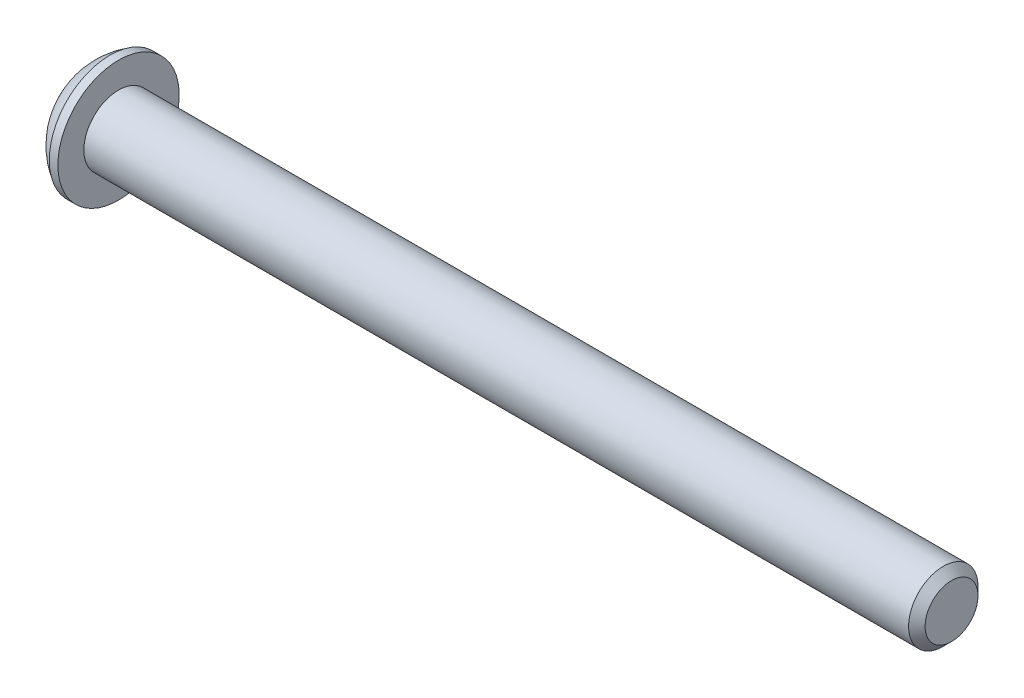
ISO-10303-21;
HEADER;
FILE_DESCRIPTION(('STEP AP214'),'2;1');
FILE_NAME('part.step','',(''),(''),'','','');
FILE_SCHEMA(('AUTOMOTIVE_DESIGN { 1 0 10303 214 1 1 1 1 }'));
ENDSEC;
DATA;
#1=APPLICATION_CONTEXT('core data for automotive mechanical design processes');
#2=APPLICATION_PROTOCOL_DEFINITION('international standard','automotive_design',2000,#1);
#3=PRODUCT_CONTEXT('',#1,'mechanical');
#4=PRODUCT('Part','Part','',(#3));
#5=PRODUCT_RELATED_PRODUCT_CATEGORY('part','',(#4));
#6=PRODUCT_DEFINITION_FORMATION('','',#4);
#7=PRODUCT_DEFINITION_CONTEXT('part definition',#1,'design');
#8=PRODUCT_DEFINITION('design','',#6,#7);
#9=PRODUCT_DEFINITION_SHAPE('','',#8);
#10=(LENGTH_UNIT() NAMED_UNIT(*) SI_UNIT(.MILLI.,.METRE.));
#11=(NAMED_UNIT(*) PLANE_ANGLE_UNIT() SI_UNIT($,.RADIAN.));
#12=(NAMED_UNIT(*) SI_UNIT($,.STERADIAN.) SOLID_ANGLE_UNIT());
#13=UNCERTAINTY_MEASURE_WITH_UNIT(LENGTH_MEASURE(1.E-05),#10,'distance_accuracy_value','');
#14=(GEOMETRIC_REPRESENTATION_CONTEXT(3) GLOBAL_UNCERTAINTY_ASSIGNED_CONTEXT((#13)) GLOBAL_UNIT_ASSIGNED_CONTEXT((#10,
#11,#12)) REPRESENTATION_CONTEXT('',''));
#15=CARTESIAN_POINT('',(0.,0.,0.));
#16=DIRECTION('',(0.,0.,1.));
#17=DIRECTION('',(1.,0.,0.));
#18=AXIS2_PLACEMENT_3D('',#15,#16,#17);
#19=CARTESIAN_POINT('',(0.,0.,0.));
#20=DIRECTION('',(-1.,0.,0.));
#21=DIRECTION('',(0.,0.,1.));
#22=AXIS2_PLACEMENT_3D('',#19,#20,#21);
#23=PLANE('',#22);
#24=CARTESIAN_POINT('',(0.,0.,0.));
#25=DIRECTION('',(-1.,0.,0.));
#26=DIRECTION('',(0.,0.,1.));
#27=AXIS2_PLACEMENT_3D('',#24,#25,#26);
#28=CIRCLE('',#27,2.77495);
#29=CARTESIAN_POINT('',(0.,2.77495,0.));
#30=VERTEX_POINT('',#29);
#31=EDGE_CURVE('E11',#30,#30,#28,.T.);
#32=ORIENTED_EDGE('',*,*,#31,.T.);
#33=EDGE_LOOP('',(#32));
#34=FACE_BOUND('',#33,.T.);
#35=DIRECTION('',(0.,-1.,0.));
#36=VECTOR('',#35,1.);
#37=CARTESIAN_POINT('',(0.,-1.14384635331849,1.9812));
#38=LINE('',#37,#36);
#39=CARTESIAN_POINT('',(0.,1.14384635331849,1.9812));
#40=VERTEX_POINT('',#39);
#41=CARTESIAN_POINT('',(0.,-1.14384635331849,1.9812));
#42=VERTEX_POINT('',#41);
#43=EDGE_CURVE('E47',#40,#42,#38,.T.);
#44=ORIENTED_EDGE('',*,*,#43,.T.);
#45=DIRECTION('',(0.,-0.5,-0.866025403784439));
#46=VECTOR('',#45,1.);
#47=CARTESIAN_POINT('',(0.,-2.28769270663697,0.));
#48=LINE('',#47,#46);
#49=CARTESIAN_POINT('',(0.,-2.28769270663697,0.));
#50=VERTEX_POINT('',#49);
#51=EDGE_CURVE('E363',#42,#50,#48,.T.);
#52=ORIENTED_EDGE('',*,*,#51,.T.);
#53=DIRECTION('',(0.,0.5,-0.866025403784439));
#54=VECTOR('',#53,1.);
#55=CARTESIAN_POINT('',(0.,-1.14384635331849,-1.9812));
#56=LINE('',#55,#54);
#57=CARTESIAN_POINT('',(0.,-1.14384635331849,-1.9812));
#58=VERTEX_POINT('',#57);
#59=EDGE_CURVE('E127',#50,#58,#56,.T.);
#60=ORIENTED_EDGE('',*,*,#59,.T.);
#61=DIRECTION('',(0.,1.,0.));
#62=VECTOR('',#61,1.);
#63=CARTESIAN_POINT('',(0.,1.14384635331849,-1.9812));
#64=LINE('',#63,#62);
#65=CARTESIAN_POINT('',(0.,1.14384635331849,-1.9812));
#66=VERTEX_POINT('',#65);
#67=EDGE_CURVE('E366',#58,#66,#64,.T.);
#68=ORIENTED_EDGE('',*,*,#67,.T.);
#69=DIRECTION('',(0.,0.5,0.866025403784439));
#70=VECTOR('',#69,1.);
#71=CARTESIAN_POINT('',(0.,2.28769270663697,0.));
#72=LINE('',#71,#70);
#73=CARTESIAN_POINT('',(0.,2.28769270663697,0.));
#74=VERTEX_POINT('',#73);
#75=EDGE_CURVE('E368',#66,#74,#72,.T.);
#76=ORIENTED_EDGE('',*,*,#75,.T.);
#77=DIRECTION('',(0.,-0.5,0.866025403784439));
#78=VECTOR('',#77,1.);
#79=CARTESIAN_POINT('',(0.,1.14384635331849,1.9812));
#80=LINE('',#79,#78);
#81=EDGE_CURVE('E370',#74,#40,#80,.T.);
#82=ORIENTED_EDGE('',*,*,#81,.T.);
#83=EDGE_LOOP('',(#44,#52,#60,#68,#76,#82));
#84=FACE_BOUND('',#83,.T.);
#85=ADVANCED_FACE('F33',(#34,#84),#23,.T.);
#86=CARTESIAN_POINT('',(5.78512506188119,0.,0.));
#87=DIRECTION('',(-1.,0.,0.));
#88=DIRECTION('',(0.,1.,0.));
#89=AXIS2_PLACEMENT_3D('',#86,#87,#88);
#90=SPHERICAL_SURFACE('',#89,6.41623094067739);
#91=CARTESIAN_POINT('',(2.5654,0.,0.));
#92=DIRECTION('',(-1.,0.,0.));
#93=DIRECTION('',(0.,0.,1.));
#94=AXIS2_PLACEMENT_3D('',#91,#92,#93);
#95=CIRCLE('',#94,5.5499);
#96=CARTESIAN_POINT('',(2.5654,5.5499,0.));
#97=VERTEX_POINT('',#96);
#98=EDGE_CURVE('E40',#97,#97,#95,.T.);
#99=CARTESIAN_POINT('',(2.5654,5.5499,0.));
#100=CARTESIAN_POINT('',(2.53083708566419,5.52984868712258,0.));
#101=CARTESIAN_POINT('',(2.49646152825914,5.50947442663449,0.));
#102=CARTESIAN_POINT('',(2.42809701945272,5.4680872977392,0.));
#103=CARTESIAN_POINT('',(2.39410806805135,5.447074429332,0.));
#104=CARTESIAN_POINT('',(2.32652866339446,5.40441737190071,0.));
#105=CARTESIAN_POINT('',(2.29293821013895,5.38277318287661,0.));
#106=CARTESIAN_POINT('',(2.22616751866502,5.33886105159856,0.));
#107=CARTESIAN_POINT('',(2.19298728044662,5.3165931093446,0.));
#108=CARTESIAN_POINT('',(2.12704860244366,5.27144124070729,0.));
#109=CARTESIAN_POINT('',(2.09429016265912,5.24855731432393,0.));
#110=CARTESIAN_POINT('',(2.02920651509859,5.20218146582175,0.));
#111=CARTESIAN_POINT('',(1.99688130732261,5.17868954370292,0.));
#112=CARTESIAN_POINT('',(1.93267540683267,5.13110590319174,0.));
#113=CARTESIAN_POINT('',(1.90079471411871,5.10701418479938,0.));
#114=CARTESIAN_POINT('',(1.83748897146475,5.05823936086598,0.));
#115=CARTESIAN_POINT('',(1.80606392152475,5.03355625532495,0.));
#116=CARTESIAN_POINT('',(1.74368043314138,4.98360727255644,0.));
#117=CARTESIAN_POINT('',(1.71272199469802,4.95834139532897,0.));
#118=CARTESIAN_POINT('',(1.65128253514951,4.90723568808467,0.));
#119=CARTESIAN_POINT('',(1.62080151404435,4.88139585806785,0.));
#120=CARTESIAN_POINT('',(1.56032752837792,4.82915126447052,0.));
#121=CARTESIAN_POINT('',(1.53033456381665,4.80274650089003,0.));
#122=CARTESIAN_POINT('',(1.4708471600897,4.74938125657909,0.));
#123=CARTESIAN_POINT('',(1.44135272092403,4.72242077584864,0.));
#124=CARTESIAN_POINT('',(1.38287266283316,4.66795350762059,0.));
#125=CARTESIAN_POINT('',(1.35388704390797,4.64044672012299,0.));
#126=CARTESIAN_POINT('',(1.29643474354244,4.58489643942841,0.));
#127=CARTESIAN_POINT('',(1.26796806210209,4.55685294623144,0.));
#128=CARTESIAN_POINT('',(1.21156357281885,4.50023904253955,0.));
#129=CARTESIAN_POINT('',(1.18362576497595,4.47166863204464,0.));
#130=CARTESIAN_POINT('',(1.12828877440023,4.41401086607543,0.));
#131=CARTESIAN_POINT('',(1.10088959166741,4.38492351060113,0.));
#132=CARTESIAN_POINT('',(1.04663941482087,4.32624200742801,0.));
#133=CARTESIAN_POINT('',(1.01978842070714,4.2966478597292,0.));
#134=CARTESIAN_POINT('',(0.966643993266069,4.2369631017545,0.));
#135=CARTESIAN_POINT('',(0.94035055993872,4.20687249147862,0.));
#136=CARTESIAN_POINT('',(0.888330431624668,4.14620531128432,0.));
#137=CARTESIAN_POINT('',(0.862603736637966,4.11562874136591,0.));
#138=CARTESIAN_POINT('',(0.811726064743087,4.05400031444217,0.));
#139=CARTESIAN_POINT('',(0.786575087834911,4.02294845743684,0.));
#140=CARTESIAN_POINT('',(0.736857630884291,3.96038029479081,0.));
#141=CARTESIAN_POINT('',(0.712291150841848,3.9288639891501,0.));
#142=CARTESIAN_POINT('',(0.6637512623949,3.8653779297977,0.));
#143=CARTESIAN_POINT('',(0.639777853990396,3.833408176086,0.));
#144=CARTESIAN_POINT('',(0.592432476584127,3.76902637942894,0.));
#145=CARTESIAN_POINT('',(0.569060507582362,3.73661433648358,0.));
#146=CARTESIAN_POINT('',(0.522926166816147,3.67135927457555,0.));
#147=CARTESIAN_POINT('',(0.500163795051696,3.63851625561289,0.));
#148=CARTESIAN_POINT('',(0.455256593824864,3.57241070531295,0.));
#149=CARTESIAN_POINT('',(0.433111764362482,3.53914817397566,0.));
#150=CARTESIAN_POINT('',(0.389447377232278,3.47221520900886,0.));
#151=CARTESIAN_POINT('',(0.367927819564456,3.43854477537934,0.));
#152=CARTESIAN_POINT('',(0.325521487354906,3.37080775824281,0.));
#153=CARTESIAN_POINT('',(0.304634712813178,3.3367411747358,0.));
#154=CARTESIAN_POINT('',(0.263501236996927,3.26822374869429,0.));
#155=CARTESIAN_POINT('',(0.243254535722403,3.23377290615979,0.));
#156=CARTESIAN_POINT('',(0.203408274368182,3.16449898643303,0.));
#157=CARTESIAN_POINT('',(0.183808714288484,3.12967590924077,0.));
#158=CARTESIAN_POINT('',(0.14526357289266,3.05966967674634,0.));
#159=CARTESIAN_POINT('',(0.126317991576534,3.02448652144419,0.));
#160=CARTESIAN_POINT('',(0.089087433723099,2.95377240655615,0.));
#161=CARTESIAN_POINT('',(0.0708024571857911,2.91824144697028,0.));
#162=CARTESIAN_POINT('',(0.0348994419493881,2.84684415010637,0.));
#163=CARTESIAN_POINT('',(0.017281403250293,2.81097781282834,0.));
#164=CARTESIAN_POINT('',(0.,2.77495,0.));
#165=B_SPLINE_CURVE_WITH_KNOTS('',3,(#99,#100,#101,#102,#103,#104,#105,#106,#107,#108,#109,#110,
#111,#112,#113,#114,#115,#116,#117,#118,#119,#120,#121,#122,#123,#124,#125,#126,#127,#128,#129,
#130,#131,#132,#133,#134,#135,#136,#137,#138,#139,#140,#141,#142,#143,#144,#145,#146,#147,#148,
#149,#150,#151,#152,#153,#154,#155,#156,#157,#158,#159,#160,#161,#162,#163,#164),.UNSPECIFIED.,
.F.,.F.,(4,2,2,2,2,2,2,2,2,2,2,2,2,2,2,2,2,2,2,2,2,2,2,2,2,2,2,2,2,2,2,2,4),(0.,
0.119872570538484,0.239745141076968,0.359617711615453,0.479490282153937,0.599362852692421,
0.719235423230905,0.83910799376939,0.958980564307873,1.07885313484636,1.19872570538484,
1.31859827592333,1.43847084646181,1.55834341700029,1.67821598753878,1.79808855807726,
1.91796112861575,2.03783369915423,2.15770626969271,2.2775788402312,2.39745141076968,
2.51732398130817,2.63719655184665,2.75706912238513,2.87694169292362,2.9968142634621,
3.11668683400059,3.23655940453907,3.35643197507756,3.47630454561604,3.59617711615452,
3.71604968669301,3.83592225723149),.UNSPECIFIED.);
#166=EDGE_CURVE('BSEAM154',#97,#30,#165,.T.);
#167=ORIENTED_EDGE('',*,*,#98,.T.);
#168=ORIENTED_EDGE('',*,*,#31,.F.);
#169=ORIENTED_EDGE('',*,*,#166,.T.);
#170=ORIENTED_EDGE('',*,*,#166,.F.);
#171=EDGE_LOOP('',(#167,#169,#168,#170));
#172=FACE_BOUND('',#171,.T.);
#173=ADVANCED_FACE('F154',(#172),#90,.T.);
#174=CARTESIAN_POINT('',(0.,0.,0.));
#175=DIRECTION('',(-1.,0.,0.));
#176=DIRECTION('',(0.,0.,1.));
#177=AXIS2_PLACEMENT_3D('',#174,#175,#176);
#178=CYLINDRICAL_SURFACE('',#177,5.5499);
#179=ORIENTED_EDGE('',*,*,#98,.F.);
#180=EDGE_LOOP('',(#179));
#181=FACE_BOUND('',#180,.T.);
#182=CARTESIAN_POINT('',(3.3528,0.,0.));
#183=DIRECTION('',(-1.,0.,0.));
#184=DIRECTION('',(0.,0.,1.));
#185=AXIS2_PLACEMENT_3D('',#182,#183,#184);
#186=CIRCLE('',#185,5.5499);
#187=CARTESIAN_POINT('',(3.3528,0.,5.5499));
#188=VERTEX_POINT('',#187);
#189=EDGE_CURVE('E149',#188,#188,#186,.T.);
#190=ORIENTED_EDGE('',*,*,#189,.T.);
#191=EDGE_LOOP('',(#190));
#192=FACE_BOUND('',#191,.T.);
#193=ADVANCED_FACE('F157',(#181,#192),#178,.T.);
#194=CARTESIAN_POINT('',(3.3528,3.17499999999999,0.));
#195=DIRECTION('',(-1.,0.,0.));
#196=DIRECTION('',(0.,0.,1.));
#197=AXIS2_PLACEMENT_3D('',#194,#195,#196);
#198=PLANE('',#197);
#199=ORIENTED_EDGE('',*,*,#189,.F.);
#200=EDGE_LOOP('',(#199));
#201=FACE_BOUND('',#200,.T.);
#202=CARTESIAN_POINT('',(3.3528,0.,0.));
#203=DIRECTION('',(-1.,0.,0.));
#204=DIRECTION('',(0.,0.,1.));
#205=AXIS2_PLACEMENT_3D('',#202,#203,#204);
#206=CIRCLE('',#205,3.17499999999999);
#207=CARTESIAN_POINT('',(3.3528,0.,3.17499999999999));
#208=VERTEX_POINT('',#207);
#209=EDGE_CURVE('E146',#208,#208,#206,.T.);
#210=ORIENTED_EDGE('',*,*,#209,.T.);
#211=EDGE_LOOP('',(#210));
#212=FACE_BOUND('',#211,.T.);
#213=ADVANCED_FACE('F160',(#201,#212),#198,.F.);
#214=CARTESIAN_POINT('',(0.,0.,0.));
#215=DIRECTION('',(-1.,0.,0.));
#216=DIRECTION('',(0.,0.,1.));
#217=AXIS2_PLACEMENT_3D('',#214,#215,#216);
#218=CYLINDRICAL_SURFACE('',#217,3.175);
#219=ORIENTED_EDGE('',*,*,#209,.F.);
#220=EDGE_LOOP('',(#219));
#221=FACE_BOUND('',#220,.T.);
#222=CARTESIAN_POINT('',(78.79715,0.,0.));
#223=DIRECTION('',(-1.,0.,0.));
#224=DIRECTION('',(0.,0.,1.));
#225=AXIS2_PLACEMENT_3D('',#222,#223,#224);
#226=CIRCLE('',#225,3.175);
#227=CARTESIAN_POINT('',(78.79715,0.,3.175));
#228=VERTEX_POINT('',#227);
#229=EDGE_CURVE('E143',#228,#228,#226,.T.);
#230=ORIENTED_EDGE('',*,*,#229,.T.);
#231=EDGE_LOOP('',(#230));
#232=FACE_BOUND('',#231,.T.);
#233=ADVANCED_FACE('F166',(#221,#232),#218,.T.);
#234=CARTESIAN_POINT('',(79.5528,0.,0.));
#235=DIRECTION('',(-1.,0.,0.));
#236=DIRECTION('',(0.,0.,1.));
#237=AXIS2_PLACEMENT_3D('',#234,#235,#236);
#238=CONICAL_SURFACE('',#237,2.41935,0.785398163397451);
#239=ORIENTED_EDGE('',*,*,#229,.F.);
#240=EDGE_LOOP('',(#239));
#241=FACE_BOUND('',#240,.T.);
#242=CARTESIAN_POINT('',(79.5528,0.,0.));
#243=DIRECTION('',(-1.,0.,0.));
#244=DIRECTION('',(0.,0.,1.));
#245=AXIS2_PLACEMENT_3D('',#242,#243,#244);
#246=CIRCLE('',#245,2.41935);
#247=CARTESIAN_POINT('',(79.5528,0.,2.41935));
#248=VERTEX_POINT('',#247);
#249=EDGE_CURVE('E139',#248,#248,#246,.T.);
#250=ORIENTED_EDGE('',*,*,#249,.T.);
#251=EDGE_LOOP('',(#250));
#252=FACE_BOUND('',#251,.T.);
#253=ADVANCED_FACE('F172',(#241,#252),#238,.T.);
#254=CARTESIAN_POINT('',(79.5528,0.,0.));
#255=DIRECTION('',(-1.,0.,0.));
#256=DIRECTION('',(0.,0.,1.));
#257=AXIS2_PLACEMENT_3D('',#254,#255,#256);
#258=PLANE('',#257);
#259=ORIENTED_EDGE('',*,*,#249,.F.);
#260=EDGE_LOOP('',(#259));
#261=FACE_BOUND('',#260,.T.);
#262=ADVANCED_FACE('F178',(#261),#258,.F.);
#263=CARTESIAN_POINT('',(2.2098,-2.28769270663697,0.));
#264=DIRECTION('',(0.,0.866025403784439,-0.5));
#265=DIRECTION('',(0.,0.5,0.866025403784439));
#266=AXIS2_PLACEMENT_3D('',#263,#264,#265);
#267=PLANE('',#266);
#268=DIRECTION('',(0.,-0.5,-0.866025403784439));
#269=VECTOR('',#268,1.);
#270=CARTESIAN_POINT('',(2.2098,-2.28769270663697,0.));
#271=LINE('',#270,#269);
#272=CARTESIAN_POINT('',(2.2098,-1.14384635331849,1.9812));
#273=VERTEX_POINT('',#272);
#274=CARTESIAN_POINT('',(2.2098,-1.71576952997773,0.9906));
#275=VERTEX_POINT('',#274);
#276=EDGE_CURVE('E113',#273,#275,#271,.T.);
#277=ORIENTED_EDGE('',*,*,#276,.T.);
#278=CARTESIAN_POINT('',(2.2098,-2.28769270663697,0.));
#279=VERTEX_POINT('',#278);
#280=EDGE_CURVE('E108',#275,#279,#271,.T.);
#281=ORIENTED_EDGE('',*,*,#280,.T.);
#282=DIRECTION('',(-1.,0.,0.));
#283=VECTOR('',#282,1.);
#284=CARTESIAN_POINT('',(2.2098,-2.28769270663697,0.));
#285=LINE('',#284,#283);
#286=EDGE_CURVE('E110',#279,#50,#285,.T.);
#287=ORIENTED_EDGE('',*,*,#286,.T.);
#288=ORIENTED_EDGE('',*,*,#51,.F.);
#289=DIRECTION('',(-1.,0.,0.));
#290=VECTOR('',#289,1.);
#291=CARTESIAN_POINT('',(2.2098,-1.14384635331849,1.9812));
#292=LINE('',#291,#290);
#293=EDGE_CURVE('E358',#273,#42,#292,.T.);
#294=ORIENTED_EDGE('',*,*,#293,.F.);
#295=EDGE_LOOP('',(#277,#281,#287,#288,#294));
#296=FACE_BOUND('',#295,.T.);
#297=ADVANCED_FACE('F109',(#296),#267,.T.);
#298=CARTESIAN_POINT('',(2.2098,-1.14384635331849,-1.9812));
#299=DIRECTION('',(0.,0.866025403784439,0.5));
#300=DIRECTION('',(0.,-0.5,0.866025403784439));
#301=AXIS2_PLACEMENT_3D('',#298,#299,#300);
#302=PLANE('',#301);
#303=DIRECTION('',(0.,0.5,-0.866025403784439));
#304=VECTOR('',#303,1.);
#305=CARTESIAN_POINT('',(2.2098,-1.14384635331849,-1.9812));
#306=LINE('',#305,#304);
#307=CARTESIAN_POINT('',(2.2098,-1.71576952997773,-0.9906));
#308=VERTEX_POINT('',#307);
#309=EDGE_CURVE('E55',#279,#308,#306,.T.);
#310=ORIENTED_EDGE('',*,*,#309,.T.);
#311=CARTESIAN_POINT('',(2.2098,-1.14384635331849,-1.9812));
#312=VERTEX_POINT('',#311);
#313=EDGE_CURVE('E122',#308,#312,#306,.T.);
#314=ORIENTED_EDGE('',*,*,#313,.T.);
#315=DIRECTION('',(-1.,0.,0.));
#316=VECTOR('',#315,1.);
#317=CARTESIAN_POINT('',(2.2098,-1.14384635331849,-1.9812));
#318=LINE('',#317,#316);
#319=EDGE_CURVE('E129',#312,#58,#318,.T.);
#320=ORIENTED_EDGE('',*,*,#319,.T.);
#321=ORIENTED_EDGE('',*,*,#59,.F.);
#322=ORIENTED_EDGE('',*,*,#286,.F.);
#323=EDGE_LOOP('',(#310,#314,#320,#321,#322));
#324=FACE_BOUND('',#323,.T.);
#325=ADVANCED_FACE('F125',(#324),#302,.T.);
#326=CARTESIAN_POINT('',(2.2098,1.14384635331849,-1.9812));
#327=DIRECTION('',(0.,0.,1.));
#328=DIRECTION('',(1.,0.,0.));
#329=AXIS2_PLACEMENT_3D('',#326,#327,#328);
#330=PLANE('',#329);
#331=DIRECTION('',(0.,1.,0.));
#332=VECTOR('',#331,1.);
#333=CARTESIAN_POINT('',(2.2098,1.14384635331849,-1.9812));
#334=LINE('',#333,#332);
#335=CARTESIAN_POINT('',(2.2098,0.,-1.9812));
#336=VERTEX_POINT('',#335);
#337=EDGE_CURVE('E388',#312,#336,#334,.T.);
#338=ORIENTED_EDGE('',*,*,#337,.T.);
#339=CARTESIAN_POINT('',(2.2098,1.14384635331849,-1.9812));
#340=VERTEX_POINT('',#339);
#341=EDGE_CURVE('E121',#336,#340,#334,.T.);
#342=ORIENTED_EDGE('',*,*,#341,.T.);
#343=DIRECTION('',(-1.,0.,0.));
#344=VECTOR('',#343,1.);
#345=CARTESIAN_POINT('',(2.2098,1.14384635331849,-1.9812));
#346=LINE('',#345,#344);
#347=EDGE_CURVE('E134',#340,#66,#346,.T.);
#348=ORIENTED_EDGE('',*,*,#347,.T.);
#349=ORIENTED_EDGE('',*,*,#67,.F.);
#350=ORIENTED_EDGE('',*,*,#319,.F.);
#351=EDGE_LOOP('',(#338,#342,#348,#349,#350));
#352=FACE_BOUND('',#351,.T.);
#353=ADVANCED_FACE('F237',(#352),#330,.T.);
#354=CARTESIAN_POINT('',(2.2098,2.28769270663697,0.));
#355=DIRECTION('',(0.,-0.866025403784439,0.5));
#356=DIRECTION('',(0.,-0.5,-0.866025403784439));
#357=AXIS2_PLACEMENT_3D('',#354,#355,#356);
#358=PLANE('',#357);
#359=DIRECTION('',(0.,0.5,0.866025403784439));
#360=VECTOR('',#359,1.);
#361=CARTESIAN_POINT('',(2.2098,2.28769270663697,0.));
#362=LINE('',#361,#360);
#363=CARTESIAN_POINT('',(2.2098,1.71576952997773,-0.990600000000001));
#364=VERTEX_POINT('',#363);
#365=EDGE_CURVE('E392',#340,#364,#362,.T.);
#366=ORIENTED_EDGE('',*,*,#365,.T.);
#367=CARTESIAN_POINT('',(2.2098,2.28769270663697,0.));
#368=VERTEX_POINT('',#367);
#369=EDGE_CURVE('E390',#364,#368,#362,.T.);
#370=ORIENTED_EDGE('',*,*,#369,.T.);
#371=DIRECTION('',(-1.,0.,0.));
#372=VECTOR('',#371,1.);
#373=CARTESIAN_POINT('',(2.2098,2.28769270663697,0.));
#374=LINE('',#373,#372);
#375=EDGE_CURVE('E374',#368,#74,#374,.T.);
#376=ORIENTED_EDGE('',*,*,#375,.T.);
#377=ORIENTED_EDGE('',*,*,#75,.F.);
#378=ORIENTED_EDGE('',*,*,#347,.F.);
#379=EDGE_LOOP('',(#366,#370,#376,#377,#378));
#380=FACE_BOUND('',#379,.T.);
#381=ADVANCED_FACE('F246',(#380),#358,.T.);
#382=CARTESIAN_POINT('',(2.2098,1.14384635331849,1.9812));
#383=DIRECTION('',(0.,-0.866025403784439,-0.5));
#384=DIRECTION('',(0.,0.5,-0.866025403784439));
#385=AXIS2_PLACEMENT_3D('',#382,#383,#384);
#386=PLANE('',#385);
#387=DIRECTION('',(0.,-0.5,0.866025403784439));
#388=VECTOR('',#387,1.);
#389=CARTESIAN_POINT('',(2.2098,1.14384635331849,1.9812));
#390=LINE('',#389,#388);
#391=CARTESIAN_POINT('',(2.2098,1.71576952997773,0.990600000000001));
#392=VERTEX_POINT('',#391);
#393=EDGE_CURVE('E353',#368,#392,#390,.T.);
#394=ORIENTED_EDGE('',*,*,#393,.T.);
#395=CARTESIAN_POINT('',(2.2098,1.14384635331849,1.9812));
#396=VERTEX_POINT('',#395);
#397=EDGE_CURVE('E349',#392,#396,#390,.T.);
#398=ORIENTED_EDGE('',*,*,#397,.T.);
#399=DIRECTION('',(-1.,0.,0.));
#400=VECTOR('',#399,1.);
#401=CARTESIAN_POINT('',(2.2098,1.14384635331849,1.9812));
#402=LINE('',#401,#400);
#403=EDGE_CURVE('E357',#396,#40,#402,.T.);
#404=ORIENTED_EDGE('',*,*,#403,.T.);
#405=ORIENTED_EDGE('',*,*,#81,.F.);
#406=ORIENTED_EDGE('',*,*,#375,.F.);
#407=EDGE_LOOP('',(#394,#398,#404,#405,#406));
#408=FACE_BOUND('',#407,.T.);
#409=ADVANCED_FACE('F256',(#408),#386,.T.);
#410=CARTESIAN_POINT('',(2.2098,-1.14384635331849,1.9812));
#411=DIRECTION('',(0.,0.,-1.));
#412=DIRECTION('',(0.,1.,0.));
#413=AXIS2_PLACEMENT_3D('',#410,#411,#412);
#414=PLANE('',#413);
#415=DIRECTION('',(0.,-1.,0.));
#416=VECTOR('',#415,1.);
#417=CARTESIAN_POINT('',(2.2098,-1.14384635331849,1.9812));
#418=LINE('',#417,#416);
#419=CARTESIAN_POINT('',(2.2098,0.,1.9812));
#420=VERTEX_POINT('',#419);
#421=EDGE_CURVE('E348',#396,#420,#418,.T.);
#422=ORIENTED_EDGE('',*,*,#421,.T.);
#423=EDGE_CURVE('E351',#420,#273,#418,.T.);
#424=ORIENTED_EDGE('',*,*,#423,.T.);
#425=ORIENTED_EDGE('',*,*,#293,.T.);
#426=ORIENTED_EDGE('',*,*,#43,.F.);
#427=ORIENTED_EDGE('',*,*,#403,.F.);
#428=EDGE_LOOP('',(#422,#424,#425,#426,#427));
#429=FACE_BOUND('',#428,.T.);
#430=ADVANCED_FACE('F266',(#429),#414,.T.);
#431=CARTESIAN_POINT('',(2.2098,-2.28769270663697,0.));
#432=DIRECTION('',(1.,0.,0.));
#433=DIRECTION('',(0.,0.,-1.));
#434=AXIS2_PLACEMENT_3D('',#431,#432,#433);
#435=PLANE('',#434);
#436=CARTESIAN_POINT('',(2.2098,0.,0.));
#437=DIRECTION('',(-1.,0.,0.));
#438=DIRECTION('',(0.,0.,1.));
#439=AXIS2_PLACEMENT_3D('',#436,#437,#438);
#440=CIRCLE('',#439,1.9812);
#441=EDGE_CURVE('E395',#364,#336,#440,.T.);
#442=ORIENTED_EDGE('',*,*,#441,.F.);
#443=ORIENTED_EDGE('',*,*,#365,.F.);
#444=ORIENTED_EDGE('',*,*,#341,.F.);
#445=EDGE_LOOP('',(#442,#443,#444));
#446=FACE_BOUND('',#445,.T.);
#447=ADVANCED_FACE('F276',(#446),#435,.F.);
#448=EDGE_CURVE('E140',#392,#364,#440,.T.);
#449=ORIENTED_EDGE('',*,*,#448,.F.);
#450=ORIENTED_EDGE('',*,*,#393,.F.);
#451=ORIENTED_EDGE('',*,*,#369,.F.);
#452=EDGE_LOOP('',(#449,#450,#451));
#453=FACE_BOUND('',#452,.T.);
#454=ADVANCED_FACE('F286',(#453),#435,.F.);
#455=EDGE_CURVE('E133',#420,#392,#440,.T.);
#456=ORIENTED_EDGE('',*,*,#455,.F.);
#457=ORIENTED_EDGE('',*,*,#421,.F.);
#458=ORIENTED_EDGE('',*,*,#397,.F.);
#459=EDGE_LOOP('',(#456,#457,#458));
#460=FACE_BOUND('',#459,.T.);
#461=ADVANCED_FACE('F297',(#460),#435,.F.);
#462=EDGE_CURVE('E128',#275,#420,#440,.T.);
#463=ORIENTED_EDGE('',*,*,#462,.F.);
#464=ORIENTED_EDGE('',*,*,#276,.F.);
#465=ORIENTED_EDGE('',*,*,#423,.F.);
#466=EDGE_LOOP('',(#463,#464,#465));
#467=FACE_BOUND('',#466,.T.);
#468=ADVANCED_FACE('F306',(#467),#435,.F.);
#469=EDGE_CURVE('E119',#308,#275,#440,.T.);
#470=ORIENTED_EDGE('',*,*,#469,.F.);
#471=ORIENTED_EDGE('',*,*,#309,.F.);
#472=ORIENTED_EDGE('',*,*,#280,.F.);
#473=EDGE_LOOP('',(#470,#471,#472));
#474=FACE_BOUND('',#473,.T.);
#475=ADVANCED_FACE('F118',(#474),#435,.F.);
#476=EDGE_CURVE('E389',#336,#308,#440,.T.);
#477=ORIENTED_EDGE('',*,*,#476,.F.);
#478=ORIENTED_EDGE('',*,*,#337,.F.);
#479=ORIENTED_EDGE('',*,*,#313,.F.);
#480=EDGE_LOOP('',(#477,#478,#479));
#481=FACE_BOUND('',#480,.T.);
#482=ADVANCED_FACE('F289',(#481),#435,.F.);
#483=CARTESIAN_POINT('',(3.3536463533185,0.,0.));
#484=DIRECTION('',(-1.,0.,0.));
#485=DIRECTION('',(0.,0.,1.));
#486=AXIS2_PLACEMENT_3D('',#483,#484,#485);
#487=CONICAL_SURFACE('',#486,0.,1.04719755119659);
#488=ORIENTED_EDGE('',*,*,#455,.T.);
#489=ORIENTED_EDGE('',*,*,#448,.T.);
#490=ORIENTED_EDGE('',*,*,#441,.T.);
#491=ORIENTED_EDGE('',*,*,#476,.T.);
#492=ORIENTED_EDGE('',*,*,#469,.T.);
#493=ORIENTED_EDGE('',*,*,#462,.T.);
#494=EDGE_LOOP('',(#488,#489,#490,#491,#492,#493));
#495=FACE_BOUND('',#494,.T.);
#496=CARTESIAN_POINT('',(3.3536463533185,0.,0.));
#497=VERTEX_POINT('',#496);
#498=VERTEX_LOOP('',#497);
#499=FACE_BOUND('',#498,.T.);
#500=ADVANCED_FACE('F330',(#495,#499),#487,.F.);
#501=CLOSED_SHELL('',(#85,#173,#193,#213,#233,#253,#262,#297,#325,#353,#381,#409,#430,#447,#454,
#461,#468,#475,#482,#500));
#502=MANIFOLD_SOLID_BREP('B2',#501);
#503=ADVANCED_BREP_SHAPE_REPRESENTATION('',(#18,#502),#14);
#504=SHAPE_DEFINITION_REPRESENTATION(#9,#503);
ENDSEC;
END-ISO-10303-21;
